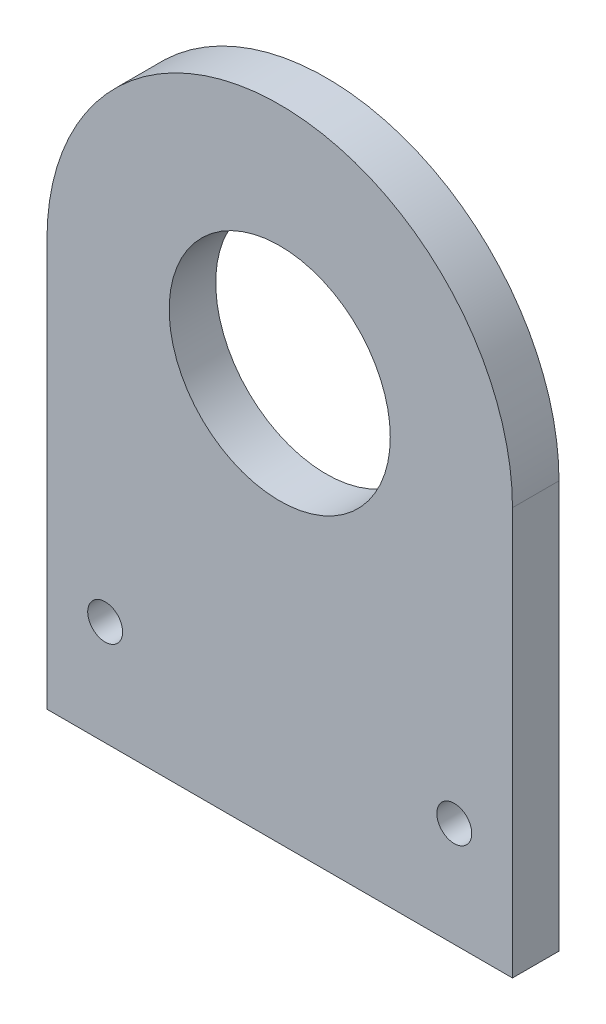
ISO-10303-21;
HEADER;
FILE_DESCRIPTION(('STEP AP214'),'2;1');
FILE_NAME('part.step','',(''),(''),'','','');
FILE_SCHEMA(('AUTOMOTIVE_DESIGN { 1 0 10303 214 1 1 1 1 }'));
ENDSEC;
DATA;
#1=APPLICATION_CONTEXT('core data for automotive mechanical design processes');
#2=APPLICATION_PROTOCOL_DEFINITION('international standard','automotive_design',2000,#1);
#3=PRODUCT_CONTEXT('',#1,'mechanical');
#4=PRODUCT('Part','Part','',(#3));
#5=PRODUCT_RELATED_PRODUCT_CATEGORY('part','',(#4));
#6=PRODUCT_DEFINITION_FORMATION('','',#4);
#7=PRODUCT_DEFINITION_CONTEXT('part definition',#1,'design');
#8=PRODUCT_DEFINITION('design','',#6,#7);
#9=PRODUCT_DEFINITION_SHAPE('','',#8);
#10=(LENGTH_UNIT() NAMED_UNIT(*) SI_UNIT(.MILLI.,.METRE.));
#11=(NAMED_UNIT(*) PLANE_ANGLE_UNIT() SI_UNIT($,.RADIAN.));
#12=(NAMED_UNIT(*) SI_UNIT($,.STERADIAN.) SOLID_ANGLE_UNIT());
#13=UNCERTAINTY_MEASURE_WITH_UNIT(LENGTH_MEASURE(1.E-05),#10,'distance_accuracy_value','');
#14=(GEOMETRIC_REPRESENTATION_CONTEXT(3) GLOBAL_UNCERTAINTY_ASSIGNED_CONTEXT((#13)) GLOBAL_UNIT_ASSIGNED_CONTEXT((#10,
#11,#12)) REPRESENTATION_CONTEXT('',''));
#15=CARTESIAN_POINT('',(0.,0.,0.));
#16=DIRECTION('',(0.,0.,1.));
#17=DIRECTION('',(1.,0.,0.));
#18=AXIS2_PLACEMENT_3D('',#15,#16,#17);
#19=CARTESIAN_POINT('',(0.,0.,4.));
#20=DIRECTION('',(0.,0.,-1.));
#21=DIRECTION('',(-1.,0.,0.));
#22=AXIS2_PLACEMENT_3D('',#19,#20,#21);
#23=CYLINDRICAL_SURFACE('',#22,20.);
#24=CARTESIAN_POINT('',(0.,0.,0.));
#25=DIRECTION('',(0.,0.,1.));
#26=DIRECTION('',(1.,0.,0.));
#27=AXIS2_PLACEMENT_3D('',#24,#25,#26);
#28=CIRCLE('',#27,20.);
#29=CARTESIAN_POINT('',(20.,0.,0.));
#30=VERTEX_POINT('',#29);
#31=CARTESIAN_POINT('',(-20.,0.,0.));
#32=VERTEX_POINT('',#31);
#33=EDGE_CURVE('E109',#30,#32,#28,.T.);
#34=ORIENTED_EDGE('',*,*,#33,.T.);
#35=DIRECTION('',(0.,0.,-1.));
#36=VECTOR('',#35,1.);
#37=CARTESIAN_POINT('',(-20.,0.,4.));
#38=LINE('',#37,#36);
#39=CARTESIAN_POINT('',(-20.,0.,4.));
#40=VERTEX_POINT('',#39);
#41=EDGE_CURVE('E11',#40,#32,#38,.T.);
#42=ORIENTED_EDGE('',*,*,#41,.F.);
#43=CARTESIAN_POINT('',(0.,0.,4.));
#44=DIRECTION('',(0.,0.,1.));
#45=DIRECTION('',(1.,0.,0.));
#46=AXIS2_PLACEMENT_3D('',#43,#44,#45);
#47=CIRCLE('',#46,20.);
#48=CARTESIAN_POINT('',(20.,0.,4.));
#49=VERTEX_POINT('',#48);
#50=EDGE_CURVE('E93',#49,#40,#47,.T.);
#51=ORIENTED_EDGE('',*,*,#50,.F.);
#52=DIRECTION('',(0.,0.,-1.));
#53=VECTOR('',#52,1.);
#54=CARTESIAN_POINT('',(20.,0.,4.));
#55=LINE('',#54,#53);
#56=EDGE_CURVE('E105',#49,#30,#55,.T.);
#57=ORIENTED_EDGE('',*,*,#56,.T.);
#58=EDGE_LOOP('',(#34,#42,#51,#57));
#59=FACE_BOUND('',#58,.T.);
#60=ADVANCED_FACE('F41',(#59),#23,.T.);
#61=CARTESIAN_POINT('',(-20.,0.,4.));
#62=DIRECTION('',(1.,0.,0.));
#63=DIRECTION('',(0.,1.,0.));
#64=AXIS2_PLACEMENT_3D('',#61,#62,#63);
#65=PLANE('',#64);
#66=DIRECTION('',(0.,-1.,0.));
#67=VECTOR('',#66,1.);
#68=CARTESIAN_POINT('',(-20.,0.,0.));
#69=LINE('',#68,#67);
#70=CARTESIAN_POINT('',(-20.,-35.,0.));
#71=VERTEX_POINT('',#70);
#72=EDGE_CURVE('E98',#32,#71,#69,.T.);
#73=ORIENTED_EDGE('',*,*,#72,.T.);
#74=DIRECTION('',(0.,0.,-1.));
#75=VECTOR('',#74,1.);
#76=CARTESIAN_POINT('',(-20.,-35.,4.));
#77=LINE('',#76,#75);
#78=CARTESIAN_POINT('',(-20.,-35.,4.));
#79=VERTEX_POINT('',#78);
#80=EDGE_CURVE('E50',#79,#71,#77,.T.);
#81=ORIENTED_EDGE('',*,*,#80,.F.);
#82=DIRECTION('',(0.,-1.,0.));
#83=VECTOR('',#82,1.);
#84=CARTESIAN_POINT('',(-20.,0.,4.));
#85=LINE('',#84,#83);
#86=EDGE_CURVE('E88',#40,#79,#85,.T.);
#87=ORIENTED_EDGE('',*,*,#86,.F.);
#88=ORIENTED_EDGE('',*,*,#41,.T.);
#89=EDGE_LOOP('',(#73,#81,#87,#88));
#90=FACE_BOUND('',#89,.T.);
#91=ADVANCED_FACE('F97',(#90),#65,.F.);
#92=CARTESIAN_POINT('',(0.,-35.,4.));
#93=DIRECTION('',(0.,1.,0.));
#94=DIRECTION('',(0.,0.,1.));
#95=AXIS2_PLACEMENT_3D('',#92,#93,#94);
#96=PLANE('',#95);
#97=DIRECTION('',(1.,0.,0.));
#98=VECTOR('',#97,1.);
#99=CARTESIAN_POINT('',(0.,-35.,0.));
#100=LINE('',#99,#98);
#101=CARTESIAN_POINT('',(20.,-35.,0.));
#102=VERTEX_POINT('',#101);
#103=EDGE_CURVE('E75',#71,#102,#100,.T.);
#104=ORIENTED_EDGE('',*,*,#103,.T.);
#105=DIRECTION('',(0.,0.,-1.));
#106=VECTOR('',#105,1.);
#107=CARTESIAN_POINT('',(20.,-35.,4.));
#108=LINE('',#107,#106);
#109=CARTESIAN_POINT('',(20.,-35.,4.));
#110=VERTEX_POINT('',#109);
#111=EDGE_CURVE('E100',#110,#102,#108,.T.);
#112=ORIENTED_EDGE('',*,*,#111,.F.);
#113=DIRECTION('',(1.,0.,0.));
#114=VECTOR('',#113,1.);
#115=CARTESIAN_POINT('',(0.,-35.,4.));
#116=LINE('',#115,#114);
#117=EDGE_CURVE('E91',#79,#110,#116,.T.);
#118=ORIENTED_EDGE('',*,*,#117,.F.);
#119=ORIENTED_EDGE('',*,*,#80,.T.);
#120=EDGE_LOOP('',(#104,#112,#118,#119));
#121=FACE_BOUND('',#120,.T.);
#122=ADVANCED_FACE('F101',(#121),#96,.F.);
#123=CARTESIAN_POINT('',(20.,0.,4.));
#124=DIRECTION('',(-1.,0.,0.));
#125=DIRECTION('',(0.,-1.,0.));
#126=AXIS2_PLACEMENT_3D('',#123,#124,#125);
#127=PLANE('',#126);
#128=DIRECTION('',(0.,1.,0.));
#129=VECTOR('',#128,1.);
#130=CARTESIAN_POINT('',(20.,0.,0.));
#131=LINE('',#130,#129);
#132=EDGE_CURVE('E81',#102,#30,#131,.T.);
#133=ORIENTED_EDGE('',*,*,#132,.T.);
#134=ORIENTED_EDGE('',*,*,#56,.F.);
#135=DIRECTION('',(0.,1.,0.));
#136=VECTOR('',#135,1.);
#137=CARTESIAN_POINT('',(20.,0.,4.));
#138=LINE('',#137,#136);
#139=EDGE_CURVE('E58',#110,#49,#138,.T.);
#140=ORIENTED_EDGE('',*,*,#139,.F.);
#141=ORIENTED_EDGE('',*,*,#111,.T.);
#142=EDGE_LOOP('',(#133,#134,#140,#141));
#143=FACE_BOUND('',#142,.T.);
#144=ADVANCED_FACE('F123',(#143),#127,.F.);
#145=CARTESIAN_POINT('',(0.,0.,4.));
#146=DIRECTION('',(0.,0.,1.));
#147=DIRECTION('',(1.,0.,0.));
#148=AXIS2_PLACEMENT_3D('',#145,#146,#147);
#149=PLANE('',#148);
#150=CARTESIAN_POINT('',(-15.,-26.,4.));
#151=DIRECTION('',(0.,0.,1.));
#152=DIRECTION('',(1.,0.,0.));
#153=AXIS2_PLACEMENT_3D('',#150,#151,#152);
#154=CIRCLE('',#153,1.5);
#155=CARTESIAN_POINT('',(-13.5,-26.,4.));
#156=VERTEX_POINT('',#155);
#157=EDGE_CURVE('E146',#156,#156,#154,.T.);
#158=ORIENTED_EDGE('',*,*,#157,.F.);
#159=EDGE_LOOP('',(#158));
#160=FACE_BOUND('',#159,.T.);
#161=CARTESIAN_POINT('',(15.,-26.,4.));
#162=DIRECTION('',(0.,0.,1.));
#163=DIRECTION('',(-1.,0.,0.));
#164=AXIS2_PLACEMENT_3D('',#161,#162,#163);
#165=CIRCLE('',#164,1.5);
#166=CARTESIAN_POINT('',(13.5,-26.,4.));
#167=VERTEX_POINT('',#166);
#168=EDGE_CURVE('E138',#167,#167,#165,.T.);
#169=ORIENTED_EDGE('',*,*,#168,.F.);
#170=EDGE_LOOP('',(#169));
#171=FACE_BOUND('',#170,.T.);
#172=CARTESIAN_POINT('',(0.,0.,4.));
#173=DIRECTION('',(0.,0.,1.));
#174=DIRECTION('',(1.,0.,0.));
#175=AXIS2_PLACEMENT_3D('',#172,#173,#174);
#176=CIRCLE('',#175,9.5);
#177=CARTESIAN_POINT('',(9.5,0.,4.));
#178=VERTEX_POINT('',#177);
#179=EDGE_CURVE('E130',#178,#178,#176,.T.);
#180=ORIENTED_EDGE('',*,*,#179,.F.);
#181=EDGE_LOOP('',(#180));
#182=FACE_BOUND('',#181,.T.);
#183=ORIENTED_EDGE('',*,*,#50,.T.);
#184=ORIENTED_EDGE('',*,*,#86,.T.);
#185=ORIENTED_EDGE('',*,*,#117,.T.);
#186=ORIENTED_EDGE('',*,*,#139,.T.);
#187=EDGE_LOOP('',(#183,#184,#185,#186));
#188=FACE_BOUND('',#187,.T.);
#189=ADVANCED_FACE('F89',(#160,#171,#182,#188),#149,.T.);
#190=CARTESIAN_POINT('',(0.,0.,0.));
#191=DIRECTION('',(0.,0.,1.));
#192=DIRECTION('',(1.,0.,0.));
#193=AXIS2_PLACEMENT_3D('',#190,#191,#192);
#194=PLANE('',#193);
#195=CARTESIAN_POINT('',(-15.,-26.,0.));
#196=DIRECTION('',(0.,0.,1.));
#197=DIRECTION('',(1.,0.,0.));
#198=AXIS2_PLACEMENT_3D('',#195,#196,#197);
#199=CIRCLE('',#198,1.5);
#200=CARTESIAN_POINT('',(-13.5,-26.,0.));
#201=VERTEX_POINT('',#200);
#202=EDGE_CURVE('E134',#201,#201,#199,.T.);
#203=ORIENTED_EDGE('',*,*,#202,.T.);
#204=EDGE_LOOP('',(#203));
#205=FACE_BOUND('',#204,.T.);
#206=CARTESIAN_POINT('',(15.,-26.,0.));
#207=DIRECTION('',(0.,0.,1.));
#208=DIRECTION('',(-1.,0.,0.));
#209=AXIS2_PLACEMENT_3D('',#206,#207,#208);
#210=CIRCLE('',#209,1.5);
#211=CARTESIAN_POINT('',(13.5,-26.,0.));
#212=VERTEX_POINT('',#211);
#213=EDGE_CURVE('E142',#212,#212,#210,.T.);
#214=ORIENTED_EDGE('',*,*,#213,.T.);
#215=EDGE_LOOP('',(#214));
#216=FACE_BOUND('',#215,.T.);
#217=CARTESIAN_POINT('',(0.,0.,0.));
#218=DIRECTION('',(0.,0.,1.));
#219=DIRECTION('',(1.,0.,0.));
#220=AXIS2_PLACEMENT_3D('',#217,#218,#219);
#221=CIRCLE('',#220,9.5);
#222=CARTESIAN_POINT('',(9.5,0.,0.));
#223=VERTEX_POINT('',#222);
#224=EDGE_CURVE('E113',#223,#223,#221,.T.);
#225=ORIENTED_EDGE('',*,*,#224,.T.);
#226=EDGE_LOOP('',(#225));
#227=FACE_BOUND('',#226,.T.);
#228=ORIENTED_EDGE('',*,*,#33,.F.);
#229=ORIENTED_EDGE('',*,*,#132,.F.);
#230=ORIENTED_EDGE('',*,*,#103,.F.);
#231=ORIENTED_EDGE('',*,*,#72,.F.);
#232=EDGE_LOOP('',(#228,#229,#230,#231));
#233=FACE_BOUND('',#232,.T.);
#234=ADVANCED_FACE('F126',(#205,#216,#227,#233),#194,.F.);
#235=CARTESIAN_POINT('',(0.,0.,0.));
#236=DIRECTION('',(0.,0.,1.));
#237=DIRECTION('',(1.,0.,0.));
#238=AXIS2_PLACEMENT_3D('',#235,#236,#237);
#239=CYLINDRICAL_SURFACE('',#238,9.5);
#240=ORIENTED_EDGE('',*,*,#224,.F.);
#241=EDGE_LOOP('',(#240));
#242=FACE_BOUND('',#241,.T.);
#243=ORIENTED_EDGE('',*,*,#179,.T.);
#244=EDGE_LOOP('',(#243));
#245=FACE_BOUND('',#244,.T.);
#246=ADVANCED_FACE('F170',(#242,#245),#239,.F.);
#247=CARTESIAN_POINT('',(15.,-26.,0.));
#248=DIRECTION('',(0.,0.,1.));
#249=DIRECTION('',(1.,0.,0.));
#250=AXIS2_PLACEMENT_3D('',#247,#248,#249);
#251=CYLINDRICAL_SURFACE('',#250,1.5);
#252=ORIENTED_EDGE('',*,*,#213,.F.);
#253=EDGE_LOOP('',(#252));
#254=FACE_BOUND('',#253,.T.);
#255=ORIENTED_EDGE('',*,*,#168,.T.);
#256=EDGE_LOOP('',(#255));
#257=FACE_BOUND('',#256,.T.);
#258=ADVANCED_FACE('F159',(#254,#257),#251,.F.);
#259=CARTESIAN_POINT('',(-15.,-26.,0.));
#260=DIRECTION('',(0.,0.,1.));
#261=DIRECTION('',(1.,0.,0.));
#262=AXIS2_PLACEMENT_3D('',#259,#260,#261);
#263=CYLINDRICAL_SURFACE('',#262,1.5);
#264=ORIENTED_EDGE('',*,*,#202,.F.);
#265=EDGE_LOOP('',(#264));
#266=FACE_BOUND('',#265,.T.);
#267=ORIENTED_EDGE('',*,*,#157,.T.);
#268=EDGE_LOOP('',(#267));
#269=FACE_BOUND('',#268,.T.);
#270=ADVANCED_FACE('F156',(#266,#269),#263,.F.);
#271=CLOSED_SHELL('',(#60,#91,#122,#144,#189,#234,#246,#258,#270));
#272=MANIFOLD_SOLID_BREP('B2',#271);
#273=ADVANCED_BREP_SHAPE_REPRESENTATION('',(#18,#272),#14);
#274=SHAPE_DEFINITION_REPRESENTATION(#9,#273);
ENDSEC;
END-ISO-10303-21;
